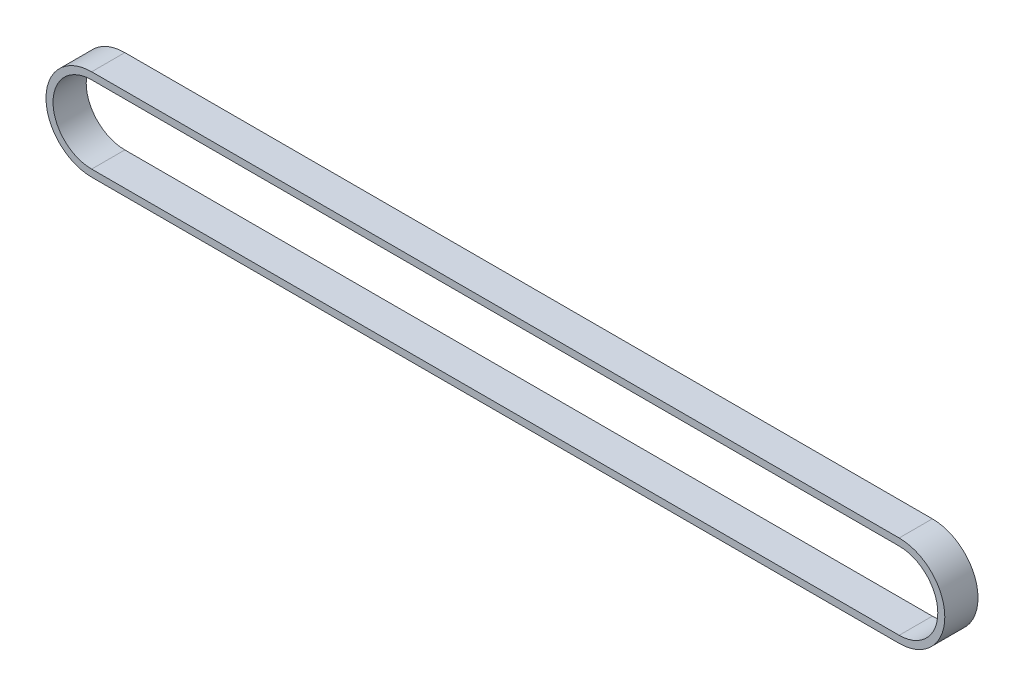
ISO-10303-21;
HEADER;
FILE_DESCRIPTION(('STEP AP214'),'2;1');
FILE_NAME('part.step','',(''),(''),'','','');
FILE_SCHEMA(('AUTOMOTIVE_DESIGN { 1 0 10303 214 1 1 1 1 }'));
ENDSEC;
DATA;
#1=APPLICATION_CONTEXT('core data for automotive mechanical design processes');
#2=APPLICATION_PROTOCOL_DEFINITION('international standard','automotive_design',2000,#1);
#3=PRODUCT_CONTEXT('',#1,'mechanical');
#4=PRODUCT('Part','Part','',(#3));
#5=PRODUCT_RELATED_PRODUCT_CATEGORY('part','',(#4));
#6=PRODUCT_DEFINITION_FORMATION('','',#4);
#7=PRODUCT_DEFINITION_CONTEXT('part definition',#1,'design');
#8=PRODUCT_DEFINITION('design','',#6,#7);
#9=PRODUCT_DEFINITION_SHAPE('','',#8);
#10=(LENGTH_UNIT() NAMED_UNIT(*) SI_UNIT(.MILLI.,.METRE.));
#11=(NAMED_UNIT(*) PLANE_ANGLE_UNIT() SI_UNIT($,.RADIAN.));
#12=(NAMED_UNIT(*) SI_UNIT($,.STERADIAN.) SOLID_ANGLE_UNIT());
#13=UNCERTAINTY_MEASURE_WITH_UNIT(LENGTH_MEASURE(1.E-05),#10,'distance_accuracy_value','');
#14=(GEOMETRIC_REPRESENTATION_CONTEXT(3) GLOBAL_UNCERTAINTY_ASSIGNED_CONTEXT((#13)) GLOBAL_UNIT_ASSIGNED_CONTEXT((#10,
#11,#12)) REPRESENTATION_CONTEXT('',''));
#15=CARTESIAN_POINT('',(0.,0.,0.));
#16=DIRECTION('',(0.,0.,1.));
#17=DIRECTION('',(1.,0.,0.));
#18=AXIS2_PLACEMENT_3D('',#15,#16,#17);
#19=CARTESIAN_POINT('',(0.,0.,15.));
#20=DIRECTION('',(0.,0.,1.));
#21=DIRECTION('',(1.,0.,0.));
#22=AXIS2_PLACEMENT_3D('',#19,#20,#21);
#23=PLANE('',#22);
#24=CARTESIAN_POINT('',(0.,0.,15.));
#25=DIRECTION('',(0.,0.,1.));
#26=DIRECTION('',(1.,0.,0.));
#27=AXIS2_PLACEMENT_3D('',#24,#25,#26);
#28=CIRCLE('',#27,20.6375);
#29=CARTESIAN_POINT('',(0.,20.6375,15.));
#30=VERTEX_POINT('',#29);
#31=CARTESIAN_POINT('',(0.,-20.6375,15.));
#32=VERTEX_POINT('',#31);
#33=EDGE_CURVE('E135',#30,#32,#28,.T.);
#34=ORIENTED_EDGE('',*,*,#33,.T.);
#35=DIRECTION('',(1.,0.,0.));
#36=VECTOR('',#35,1.);
#37=CARTESIAN_POINT('',(0.,-20.6375,15.));
#38=LINE('',#37,#36);
#39=CARTESIAN_POINT('',(364.998,-20.6375,15.));
#40=VERTEX_POINT('',#39);
#41=EDGE_CURVE('E138',#32,#40,#38,.T.);
#42=ORIENTED_EDGE('',*,*,#41,.T.);
#43=CARTESIAN_POINT('',(364.998,0.,15.));
#44=DIRECTION('',(0.,0.,1.));
#45=DIRECTION('',(1.,0.,0.));
#46=AXIS2_PLACEMENT_3D('',#43,#44,#45);
#47=CIRCLE('',#46,20.6375);
#48=CARTESIAN_POINT('',(364.998,20.6375,15.));
#49=VERTEX_POINT('',#48);
#50=EDGE_CURVE('E141',#40,#49,#47,.T.);
#51=ORIENTED_EDGE('',*,*,#50,.T.);
#52=DIRECTION('',(-1.,0.,0.));
#53=VECTOR('',#52,1.);
#54=CARTESIAN_POINT('',(0.,20.6375,15.));
#55=LINE('',#54,#53);
#56=EDGE_CURVE('E143',#49,#30,#55,.T.);
#57=ORIENTED_EDGE('',*,*,#56,.T.);
#58=EDGE_LOOP('',(#34,#42,#51,#57));
#59=FACE_BOUND('',#58,.T.);
#60=DIRECTION('',(-1.,0.,0.));
#61=VECTOR('',#60,1.);
#62=CARTESIAN_POINT('',(0.,17.4625,15.));
#63=LINE('',#62,#61);
#64=CARTESIAN_POINT('',(364.998,17.4625,15.));
#65=VERTEX_POINT('',#64);
#66=CARTESIAN_POINT('',(0.,17.4625,15.));
#67=VERTEX_POINT('',#66);
#68=EDGE_CURVE('E107',#65,#67,#63,.T.);
#69=ORIENTED_EDGE('',*,*,#68,.F.);
#70=CARTESIAN_POINT('',(364.998,0.,15.));
#71=DIRECTION('',(0.,0.,1.));
#72=DIRECTION('',(1.,0.,0.));
#73=AXIS2_PLACEMENT_3D('',#70,#71,#72);
#74=CIRCLE('',#73,17.4625);
#75=CARTESIAN_POINT('',(364.998,-17.4625,15.));
#76=VERTEX_POINT('',#75);
#77=EDGE_CURVE('E99',#76,#65,#74,.T.);
#78=ORIENTED_EDGE('',*,*,#77,.F.);
#79=DIRECTION('',(1.,0.,0.));
#80=VECTOR('',#79,1.);
#81=CARTESIAN_POINT('',(0.,-17.4625,15.));
#82=LINE('',#81,#80);
#83=CARTESIAN_POINT('',(0.,-17.4625,15.));
#84=VERTEX_POINT('',#83);
#85=EDGE_CURVE('E121',#84,#76,#82,.T.);
#86=ORIENTED_EDGE('',*,*,#85,.F.);
#87=CARTESIAN_POINT('',(0.,0.,15.));
#88=DIRECTION('',(0.,0.,1.));
#89=DIRECTION('',(1.,0.,0.));
#90=AXIS2_PLACEMENT_3D('',#87,#88,#89);
#91=CIRCLE('',#90,17.4625);
#92=EDGE_CURVE('E119',#67,#84,#91,.T.);
#93=ORIENTED_EDGE('',*,*,#92,.F.);
#94=EDGE_LOOP('',(#69,#78,#86,#93));
#95=FACE_BOUND('',#94,.T.);
#96=ADVANCED_FACE('F34',(#59,#95),#23,.T.);
#97=CARTESIAN_POINT('',(0.,0.,0.));
#98=DIRECTION('',(0.,0.,1.));
#99=DIRECTION('',(1.,0.,0.));
#100=AXIS2_PLACEMENT_3D('',#97,#98,#99);
#101=PLANE('',#100);
#102=CARTESIAN_POINT('',(0.,0.,0.));
#103=DIRECTION('',(0.,0.,1.));
#104=DIRECTION('',(1.,0.,0.));
#105=AXIS2_PLACEMENT_3D('',#102,#103,#104);
#106=CIRCLE('',#105,20.6375);
#107=CARTESIAN_POINT('',(0.,20.6375,0.));
#108=VERTEX_POINT('',#107);
#109=CARTESIAN_POINT('',(0.,-20.6375,0.));
#110=VERTEX_POINT('',#109);
#111=EDGE_CURVE('E115',#108,#110,#106,.T.);
#112=ORIENTED_EDGE('',*,*,#111,.F.);
#113=DIRECTION('',(-1.,0.,0.));
#114=VECTOR('',#113,1.);
#115=CARTESIAN_POINT('',(0.,20.6375,0.));
#116=LINE('',#115,#114);
#117=CARTESIAN_POINT('',(364.998,20.6375,0.));
#118=VERTEX_POINT('',#117);
#119=EDGE_CURVE('E139',#118,#108,#116,.T.);
#120=ORIENTED_EDGE('',*,*,#119,.F.);
#121=CARTESIAN_POINT('',(364.998,0.,0.));
#122=DIRECTION('',(0.,0.,1.));
#123=DIRECTION('',(1.,0.,0.));
#124=AXIS2_PLACEMENT_3D('',#121,#122,#123);
#125=CIRCLE('',#124,20.6375);
#126=CARTESIAN_POINT('',(364.998,-20.6375,0.));
#127=VERTEX_POINT('',#126);
#128=EDGE_CURVE('E150',#127,#118,#125,.T.);
#129=ORIENTED_EDGE('',*,*,#128,.F.);
#130=DIRECTION('',(1.,0.,0.));
#131=VECTOR('',#130,1.);
#132=CARTESIAN_POINT('',(0.,-20.6375,0.));
#133=LINE('',#132,#131);
#134=EDGE_CURVE('E148',#110,#127,#133,.T.);
#135=ORIENTED_EDGE('',*,*,#134,.F.);
#136=EDGE_LOOP('',(#112,#120,#129,#135));
#137=FACE_BOUND('',#136,.T.);
#138=CARTESIAN_POINT('',(364.998,0.,0.));
#139=DIRECTION('',(0.,0.,1.));
#140=DIRECTION('',(1.,0.,0.));
#141=AXIS2_PLACEMENT_3D('',#138,#139,#140);
#142=CIRCLE('',#141,17.4625);
#143=CARTESIAN_POINT('',(364.998,-17.4625,0.));
#144=VERTEX_POINT('',#143);
#145=CARTESIAN_POINT('',(364.998,17.4625,0.));
#146=VERTEX_POINT('',#145);
#147=EDGE_CURVE('E57',#144,#146,#142,.T.);
#148=ORIENTED_EDGE('',*,*,#147,.T.);
#149=DIRECTION('',(-1.,0.,0.));
#150=VECTOR('',#149,1.);
#151=CARTESIAN_POINT('',(0.,17.4625,0.));
#152=LINE('',#151,#150);
#153=CARTESIAN_POINT('',(0.,17.4625,0.));
#154=VERTEX_POINT('',#153);
#155=EDGE_CURVE('E114',#146,#154,#152,.T.);
#156=ORIENTED_EDGE('',*,*,#155,.T.);
#157=CARTESIAN_POINT('',(0.,0.,0.));
#158=DIRECTION('',(0.,0.,1.));
#159=DIRECTION('',(1.,0.,0.));
#160=AXIS2_PLACEMENT_3D('',#157,#158,#159);
#161=CIRCLE('',#160,17.4625);
#162=CARTESIAN_POINT('',(0.,-17.4625,0.));
#163=VERTEX_POINT('',#162);
#164=EDGE_CURVE('E127',#154,#163,#161,.T.);
#165=ORIENTED_EDGE('',*,*,#164,.T.);
#166=DIRECTION('',(1.,0.,0.));
#167=VECTOR('',#166,1.);
#168=CARTESIAN_POINT('',(0.,-17.4625,0.));
#169=LINE('',#168,#167);
#170=EDGE_CURVE('E108',#163,#144,#169,.T.);
#171=ORIENTED_EDGE('',*,*,#170,.T.);
#172=EDGE_LOOP('',(#148,#156,#165,#171));
#173=FACE_BOUND('',#172,.T.);
#174=ADVANCED_FACE('F168',(#137,#173),#101,.F.);
#175=CARTESIAN_POINT('',(0.,0.,15.));
#176=DIRECTION('',(0.,0.,-1.));
#177=DIRECTION('',(-1.,0.,0.));
#178=AXIS2_PLACEMENT_3D('',#175,#176,#177);
#179=CYLINDRICAL_SURFACE('',#178,20.6375);
#180=ORIENTED_EDGE('',*,*,#111,.T.);
#181=DIRECTION('',(0.,0.,-1.));
#182=VECTOR('',#181,1.);
#183=CARTESIAN_POINT('',(0.,-20.6375,15.));
#184=LINE('',#183,#182);
#185=EDGE_CURVE('E11',#32,#110,#184,.T.);
#186=ORIENTED_EDGE('',*,*,#185,.F.);
#187=ORIENTED_EDGE('',*,*,#33,.F.);
#188=DIRECTION('',(0.,0.,-1.));
#189=VECTOR('',#188,1.);
#190=CARTESIAN_POINT('',(0.,20.6375,15.));
#191=LINE('',#190,#189);
#192=EDGE_CURVE('E145',#30,#108,#191,.T.);
#193=ORIENTED_EDGE('',*,*,#192,.T.);
#194=EDGE_LOOP('',(#180,#186,#187,#193));
#195=FACE_BOUND('',#194,.T.);
#196=ADVANCED_FACE('F36',(#195),#179,.T.);
#197=CARTESIAN_POINT('',(0.,-20.6375,15.));
#198=DIRECTION('',(0.,1.,0.));
#199=DIRECTION('',(-1.,0.,0.));
#200=AXIS2_PLACEMENT_3D('',#197,#198,#199);
#201=PLANE('',#200);
#202=ORIENTED_EDGE('',*,*,#134,.T.);
#203=DIRECTION('',(0.,0.,-1.));
#204=VECTOR('',#203,1.);
#205=CARTESIAN_POINT('',(364.998,-20.6375,15.));
#206=LINE('',#205,#204);
#207=EDGE_CURVE('E42',#40,#127,#206,.T.);
#208=ORIENTED_EDGE('',*,*,#207,.F.);
#209=ORIENTED_EDGE('',*,*,#41,.F.);
#210=ORIENTED_EDGE('',*,*,#185,.T.);
#211=EDGE_LOOP('',(#202,#208,#209,#210));
#212=FACE_BOUND('',#211,.T.);
#213=ADVANCED_FACE('F178',(#212),#201,.F.);
#214=CARTESIAN_POINT('',(364.998,0.,15.));
#215=DIRECTION('',(0.,0.,-1.));
#216=DIRECTION('',(-1.,0.,0.));
#217=AXIS2_PLACEMENT_3D('',#214,#215,#216);
#218=CYLINDRICAL_SURFACE('',#217,20.6375);
#219=ORIENTED_EDGE('',*,*,#128,.T.);
#220=DIRECTION('',(0.,0.,-1.));
#221=VECTOR('',#220,1.);
#222=CARTESIAN_POINT('',(364.998,20.6375,15.));
#223=LINE('',#222,#221);
#224=EDGE_CURVE('E155',#49,#118,#223,.T.);
#225=ORIENTED_EDGE('',*,*,#224,.F.);
#226=ORIENTED_EDGE('',*,*,#50,.F.);
#227=ORIENTED_EDGE('',*,*,#207,.T.);
#228=EDGE_LOOP('',(#219,#225,#226,#227));
#229=FACE_BOUND('',#228,.T.);
#230=ADVANCED_FACE('F162',(#229),#218,.T.);
#231=CARTESIAN_POINT('',(0.,20.6375,15.));
#232=DIRECTION('',(0.,-1.,0.));
#233=DIRECTION('',(1.,0.,0.));
#234=AXIS2_PLACEMENT_3D('',#231,#232,#233);
#235=PLANE('',#234);
#236=ORIENTED_EDGE('',*,*,#119,.T.);
#237=ORIENTED_EDGE('',*,*,#192,.F.);
#238=ORIENTED_EDGE('',*,*,#56,.F.);
#239=ORIENTED_EDGE('',*,*,#224,.T.);
#240=EDGE_LOOP('',(#236,#237,#238,#239));
#241=FACE_BOUND('',#240,.T.);
#242=ADVANCED_FACE('F172',(#241),#235,.F.);
#243=CARTESIAN_POINT('',(364.998,0.,15.));
#244=DIRECTION('',(0.,0.,-1.));
#245=DIRECTION('',(-1.,0.,0.));
#246=AXIS2_PLACEMENT_3D('',#243,#244,#245);
#247=CYLINDRICAL_SURFACE('',#246,17.4625);
#248=ORIENTED_EDGE('',*,*,#147,.F.);
#249=DIRECTION('',(0.,0.,-1.));
#250=VECTOR('',#249,1.);
#251=CARTESIAN_POINT('',(364.998,-17.4625,15.));
#252=LINE('',#251,#250);
#253=EDGE_CURVE('E103',#76,#144,#252,.T.);
#254=ORIENTED_EDGE('',*,*,#253,.F.);
#255=ORIENTED_EDGE('',*,*,#77,.T.);
#256=DIRECTION('',(0.,0.,-1.));
#257=VECTOR('',#256,1.);
#258=CARTESIAN_POINT('',(364.998,17.4625,15.));
#259=LINE('',#258,#257);
#260=EDGE_CURVE('E102',#65,#146,#259,.T.);
#261=ORIENTED_EDGE('',*,*,#260,.T.);
#262=EDGE_LOOP('',(#248,#254,#255,#261));
#263=FACE_BOUND('',#262,.T.);
#264=ADVANCED_FACE('F101',(#263),#247,.F.);
#265=CARTESIAN_POINT('',(0.,17.4625,15.));
#266=DIRECTION('',(0.,-1.,0.));
#267=DIRECTION('',(0.,0.,-1.));
#268=AXIS2_PLACEMENT_3D('',#265,#266,#267);
#269=PLANE('',#268);
#270=ORIENTED_EDGE('',*,*,#155,.F.);
#271=ORIENTED_EDGE('',*,*,#260,.F.);
#272=ORIENTED_EDGE('',*,*,#68,.T.);
#273=DIRECTION('',(0.,0.,-1.));
#274=VECTOR('',#273,1.);
#275=CARTESIAN_POINT('',(0.,17.4625,15.));
#276=LINE('',#275,#274);
#277=EDGE_CURVE('E116',#67,#154,#276,.T.);
#278=ORIENTED_EDGE('',*,*,#277,.T.);
#279=EDGE_LOOP('',(#270,#271,#272,#278));
#280=FACE_BOUND('',#279,.T.);
#281=ADVANCED_FACE('F111',(#280),#269,.T.);
#282=CARTESIAN_POINT('',(0.,0.,15.));
#283=DIRECTION('',(0.,0.,-1.));
#284=DIRECTION('',(-1.,0.,0.));
#285=AXIS2_PLACEMENT_3D('',#282,#283,#284);
#286=CYLINDRICAL_SURFACE('',#285,17.4625);
#287=ORIENTED_EDGE('',*,*,#164,.F.);
#288=ORIENTED_EDGE('',*,*,#277,.F.);
#289=ORIENTED_EDGE('',*,*,#92,.T.);
#290=DIRECTION('',(0.,0.,-1.));
#291=VECTOR('',#290,1.);
#292=CARTESIAN_POINT('',(0.,-17.4625,15.));
#293=LINE('',#292,#291);
#294=EDGE_CURVE('E49',#84,#163,#293,.T.);
#295=ORIENTED_EDGE('',*,*,#294,.T.);
#296=EDGE_LOOP('',(#287,#288,#289,#295));
#297=FACE_BOUND('',#296,.T.);
#298=ADVANCED_FACE('F201',(#297),#286,.F.);
#299=CARTESIAN_POINT('',(0.,-17.4625,15.));
#300=DIRECTION('',(0.,1.,0.));
#301=DIRECTION('',(0.,0.,1.));
#302=AXIS2_PLACEMENT_3D('',#299,#300,#301);
#303=PLANE('',#302);
#304=ORIENTED_EDGE('',*,*,#170,.F.);
#305=ORIENTED_EDGE('',*,*,#294,.F.);
#306=ORIENTED_EDGE('',*,*,#85,.T.);
#307=ORIENTED_EDGE('',*,*,#253,.T.);
#308=EDGE_LOOP('',(#304,#305,#306,#307));
#309=FACE_BOUND('',#308,.T.);
#310=ADVANCED_FACE('F205',(#309),#303,.T.);
#311=CLOSED_SHELL('',(#96,#174,#196,#213,#230,#242,#264,#281,#298,#310));
#312=MANIFOLD_SOLID_BREP('B2',#311);
#313=ADVANCED_BREP_SHAPE_REPRESENTATION('',(#18,#312),#14);
#314=SHAPE_DEFINITION_REPRESENTATION(#9,#313);
ENDSEC;
END-ISO-10303-21;
